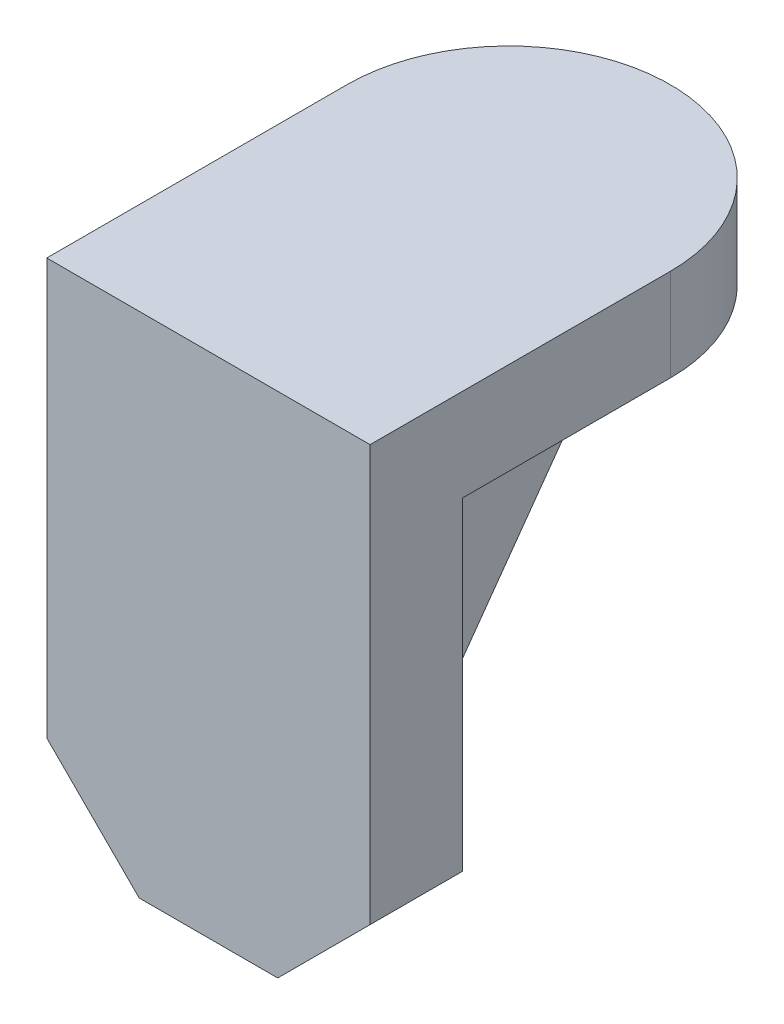
ISO-10303-21;
HEADER;
FILE_DESCRIPTION(('STEP AP214'),'2;1');
FILE_NAME('part.step','',(''),(''),'','','');
FILE_SCHEMA(('AUTOMOTIVE_DESIGN { 1 0 10303 214 1 1 1 1 }'));
ENDSEC;
DATA;
#1=APPLICATION_CONTEXT('core data for automotive mechanical design processes');
#2=APPLICATION_PROTOCOL_DEFINITION('international standard','automotive_design',2000,#1);
#3=PRODUCT_CONTEXT('',#1,'mechanical');
#4=PRODUCT('Part','Part','',(#3));
#5=PRODUCT_RELATED_PRODUCT_CATEGORY('part','',(#4));
#6=PRODUCT_DEFINITION_FORMATION('','',#4);
#7=PRODUCT_DEFINITION_CONTEXT('part definition',#1,'design');
#8=PRODUCT_DEFINITION('design','',#6,#7);
#9=PRODUCT_DEFINITION_SHAPE('','',#8);
#10=(LENGTH_UNIT() NAMED_UNIT(*) SI_UNIT(.MILLI.,.METRE.));
#11=(NAMED_UNIT(*) PLANE_ANGLE_UNIT() SI_UNIT($,.RADIAN.));
#12=(NAMED_UNIT(*) SI_UNIT($,.STERADIAN.) SOLID_ANGLE_UNIT());
#13=UNCERTAINTY_MEASURE_WITH_UNIT(LENGTH_MEASURE(1.E-05),#10,'distance_accuracy_value','');
#14=(GEOMETRIC_REPRESENTATION_CONTEXT(3) GLOBAL_UNCERTAINTY_ASSIGNED_CONTEXT((#13)) GLOBAL_UNIT_ASSIGNED_CONTEXT((#10,
#11,#12)) REPRESENTATION_CONTEXT('',''));
#15=CARTESIAN_POINT('',(0.,0.,0.));
#16=DIRECTION('',(0.,0.,1.));
#17=DIRECTION('',(1.,0.,0.));
#18=AXIS2_PLACEMENT_3D('',#15,#16,#17);
#19=CARTESIAN_POINT('',(0.,0.,0.));
#20=DIRECTION('',(0.,0.,1.));
#21=DIRECTION('',(1.,0.,0.));
#22=AXIS2_PLACEMENT_3D('',#19,#20,#21);
#23=PLANE('',#22);
#24=DIRECTION('',(0.,1.,0.));
#25=VECTOR('',#24,1.);
#26=CARTESIAN_POINT('',(-16.5418995171564,0.,0.));
#27=LINE('',#26,#25);
#28=CARTESIAN_POINT('',(-16.5418995171564,-11.0394060297859,0.));
#29=VERTEX_POINT('',#28);
#30=CARTESIAN_POINT('',(-16.5418995171564,42.9605939702141,0.));
#31=VERTEX_POINT('',#30);
#32=EDGE_CURVE('E66',#29,#31,#27,.T.);
#33=ORIENTED_EDGE('',*,*,#32,.F.);
#34=DIRECTION('',(1.,0.,0.));
#35=VECTOR('',#34,1.);
#36=CARTESIAN_POINT('',(-19.5418995171564,-11.0394060297859,0.));
#37=LINE('',#36,#35);
#38=CARTESIAN_POINT('',(-19.5418995171564,-11.0394060297859,0.));
#39=VERTEX_POINT('',#38);
#40=EDGE_CURVE('E210',#39,#29,#37,.T.);
#41=ORIENTED_EDGE('',*,*,#40,.F.);
#42=DIRECTION('',(0.707106781186548,-0.707106781186547,0.));
#43=VECTOR('',#42,1.);
#44=CARTESIAN_POINT('',(-31.5418995171564,0.960593970214127,0.));
#45=LINE('',#44,#43);
#46=CARTESIAN_POINT('',(-31.5418995171564,0.960593970214127,0.));
#47=VERTEX_POINT('',#46);
#48=EDGE_CURVE('E207',#47,#39,#45,.T.);
#49=ORIENTED_EDGE('',*,*,#48,.F.);
#50=DIRECTION('',(0.,-1.,0.));
#51=VECTOR('',#50,1.);
#52=CARTESIAN_POINT('',(-31.5418995171564,54.9605939702141,0.));
#53=LINE('',#52,#51);
#54=CARTESIAN_POINT('',(-31.5418995171564,42.9605939702141,0.));
#55=VERTEX_POINT('',#54);
#56=EDGE_CURVE('E181',#55,#47,#53,.T.);
#57=ORIENTED_EDGE('',*,*,#56,.F.);
#58=DIRECTION('',(-1.,0.,0.));
#59=VECTOR('',#58,1.);
#60=CARTESIAN_POINT('',(0.,42.9605939702141,0.));
#61=LINE('',#60,#59);
#62=EDGE_CURVE('E170',#31,#55,#61,.T.);
#63=ORIENTED_EDGE('',*,*,#62,.F.);
#64=EDGE_LOOP('',(#33,#41,#49,#57,#63));
#65=FACE_BOUND('',#64,.T.);
#66=ADVANCED_FACE('F41',(#65),#23,.F.);
#67=CARTESIAN_POINT('',(-4.54189951715641,-11.0394060297859,0.));
#68=VERTEX_POINT('',#67);
#69=CARTESIAN_POINT('',(-1.54189951715641,-11.0394060297859,0.));
#70=VERTEX_POINT('',#69);
#71=EDGE_CURVE('E58',#68,#70,#37,.T.);
#72=ORIENTED_EDGE('',*,*,#71,.F.);
#73=DIRECTION('',(0.,1.,0.));
#74=VECTOR('',#73,1.);
#75=CARTESIAN_POINT('',(-4.54189951715641,0.,0.));
#76=LINE('',#75,#74);
#77=CARTESIAN_POINT('',(-4.54189951715641,42.9605939702141,0.));
#78=VERTEX_POINT('',#77);
#79=EDGE_CURVE('E153',#68,#78,#76,.T.);
#80=ORIENTED_EDGE('',*,*,#79,.T.);
#81=CARTESIAN_POINT('',(10.4581004828436,42.9605939702141,0.));
#82=VERTEX_POINT('',#81);
#83=EDGE_CURVE('E171',#82,#78,#61,.T.);
#84=ORIENTED_EDGE('',*,*,#83,.F.);
#85=DIRECTION('',(0.,1.,0.));
#86=VECTOR('',#85,1.);
#87=CARTESIAN_POINT('',(10.4581004828436,0.960593970214126,0.));
#88=LINE('',#87,#86);
#89=CARTESIAN_POINT('',(10.4581004828436,0.960593970214126,0.));
#90=VERTEX_POINT('',#89);
#91=EDGE_CURVE('E189',#90,#82,#88,.T.);
#92=ORIENTED_EDGE('',*,*,#91,.F.);
#93=DIRECTION('',(0.707106781186547,0.707106781186548,0.));
#94=VECTOR('',#93,1.);
#95=CARTESIAN_POINT('',(-1.54189951715641,-11.0394060297859,0.));
#96=LINE('',#95,#94);
#97=EDGE_CURVE('E213',#70,#90,#96,.T.);
#98=ORIENTED_EDGE('',*,*,#97,.F.);
#99=EDGE_LOOP('',(#72,#80,#84,#92,#98));
#100=FACE_BOUND('',#99,.T.);
#101=ADVANCED_FACE('F259',(#100),#23,.F.);
#102=CARTESIAN_POINT('',(-31.5418995171564,54.9605939702141,12.));
#103=DIRECTION('',(0.,-1.,0.));
#104=DIRECTION('',(0.,0.,-1.));
#105=AXIS2_PLACEMENT_3D('',#102,#103,#104);
#106=PLANE('',#105);
#107=DIRECTION('',(0.,0.,-1.));
#108=VECTOR('',#107,1.);
#109=CARTESIAN_POINT('',(-31.5418995171564,54.9605939702141,12.));
#110=LINE('',#109,#108);
#111=CARTESIAN_POINT('',(-31.5418995171564,54.9605939702141,12.));
#112=VERTEX_POINT('',#111);
#113=CARTESIAN_POINT('',(-31.5418995171564,54.9605939702141,-27.));
#114=VERTEX_POINT('',#113);
#115=EDGE_CURVE('E141',#112,#114,#110,.T.);
#116=ORIENTED_EDGE('',*,*,#115,.F.);
#117=DIRECTION('',(-1.,0.,0.));
#118=VECTOR('',#117,1.);
#119=CARTESIAN_POINT('',(-31.5418995171564,54.9605939702141,12.));
#120=LINE('',#119,#118);
#121=CARTESIAN_POINT('',(10.4581004828436,54.9605939702141,12.));
#122=VERTEX_POINT('',#121);
#123=EDGE_CURVE('E185',#122,#112,#120,.T.);
#124=ORIENTED_EDGE('',*,*,#123,.F.);
#125=DIRECTION('',(0.,0.,-1.));
#126=VECTOR('',#125,1.);
#127=CARTESIAN_POINT('',(10.4581004828436,54.9605939702141,12.));
#128=LINE('',#127,#126);
#129=CARTESIAN_POINT('',(10.4581004828436,54.9605939702141,-27.));
#130=VERTEX_POINT('',#129);
#131=EDGE_CURVE('E204',#122,#130,#128,.T.);
#132=ORIENTED_EDGE('',*,*,#131,.T.);
#133=CARTESIAN_POINT('',(-10.5418995171564,54.9605939702141,-27.));
#134=DIRECTION('',(0.,1.,0.));
#135=DIRECTION('',(0.,0.,1.));
#136=AXIS2_PLACEMENT_3D('',#133,#134,#135);
#137=CIRCLE('',#136,21.);
#138=EDGE_CURVE('E158',#130,#114,#137,.T.);
#139=ORIENTED_EDGE('',*,*,#138,.T.);
#140=EDGE_LOOP('',(#116,#124,#132,#139));
#141=FACE_BOUND('',#140,.T.);
#142=ADVANCED_FACE('F43',(#141),#106,.F.);
#143=CARTESIAN_POINT('',(-31.5418995171564,54.9605939702141,12.));
#144=DIRECTION('',(1.,0.,0.));
#145=DIRECTION('',(0.,0.,-1.));
#146=AXIS2_PLACEMENT_3D('',#143,#144,#145);
#147=PLANE('',#146);
#148=ORIENTED_EDGE('',*,*,#115,.T.);
#149=DIRECTION('',(0.,1.,0.));
#150=VECTOR('',#149,1.);
#151=CARTESIAN_POINT('',(-31.5418995171564,42.9605939702141,-27.));
#152=LINE('',#151,#150);
#153=CARTESIAN_POINT('',(-31.5418995171564,42.9605939702141,-27.));
#154=VERTEX_POINT('',#153);
#155=EDGE_CURVE('E177',#154,#114,#152,.T.);
#156=ORIENTED_EDGE('',*,*,#155,.F.);
#157=DIRECTION('',(0.,0.,-1.));
#158=VECTOR('',#157,1.);
#159=CARTESIAN_POINT('',(-31.5418995171564,42.9605939702141,0.));
#160=LINE('',#159,#158);
#161=EDGE_CURVE('E167',#55,#154,#160,.T.);
#162=ORIENTED_EDGE('',*,*,#161,.F.);
#163=ORIENTED_EDGE('',*,*,#56,.T.);
#164=DIRECTION('',(0.,0.,-1.));
#165=VECTOR('',#164,1.);
#166=CARTESIAN_POINT('',(-31.5418995171564,0.960593970214127,12.));
#167=LINE('',#166,#165);
#168=CARTESIAN_POINT('',(-31.5418995171564,0.960593970214127,12.));
#169=VERTEX_POINT('',#168);
#170=EDGE_CURVE('E233',#169,#47,#167,.T.);
#171=ORIENTED_EDGE('',*,*,#170,.F.);
#172=DIRECTION('',(0.,-1.,0.));
#173=VECTOR('',#172,1.);
#174=CARTESIAN_POINT('',(-31.5418995171564,54.9605939702141,12.));
#175=LINE('',#174,#173);
#176=EDGE_CURVE('E188',#112,#169,#175,.T.);
#177=ORIENTED_EDGE('',*,*,#176,.F.);
#178=EDGE_LOOP('',(#148,#156,#162,#163,#171,#177));
#179=FACE_BOUND('',#178,.T.);
#180=ADVANCED_FACE('F243',(#179),#147,.F.);
#181=CARTESIAN_POINT('',(-31.5418995171564,0.960593970214127,12.));
#182=DIRECTION('',(0.707106781186547,0.707106781186548,0.));
#183=DIRECTION('',(-0.707106781186548,0.707106781186547,0.));
#184=AXIS2_PLACEMENT_3D('',#181,#182,#183);
#185=PLANE('',#184);
#186=ORIENTED_EDGE('',*,*,#48,.T.);
#187=DIRECTION('',(0.,0.,-1.));
#188=VECTOR('',#187,1.);
#189=CARTESIAN_POINT('',(-19.5418995171564,-11.0394060297859,12.));
#190=LINE('',#189,#188);
#191=CARTESIAN_POINT('',(-19.5418995171564,-11.0394060297859,12.));
#192=VERTEX_POINT('',#191);
#193=EDGE_CURVE('E229',#192,#39,#190,.T.);
#194=ORIENTED_EDGE('',*,*,#193,.F.);
#195=DIRECTION('',(0.707106781186548,-0.707106781186547,0.));
#196=VECTOR('',#195,1.);
#197=CARTESIAN_POINT('',(-31.5418995171564,0.960593970214127,12.));
#198=LINE('',#197,#196);
#199=EDGE_CURVE('E192',#169,#192,#198,.T.);
#200=ORIENTED_EDGE('',*,*,#199,.F.);
#201=ORIENTED_EDGE('',*,*,#170,.T.);
#202=EDGE_LOOP('',(#186,#194,#200,#201));
#203=FACE_BOUND('',#202,.T.);
#204=ADVANCED_FACE('F289',(#203),#185,.F.);
#205=CARTESIAN_POINT('',(-19.5418995171564,-11.0394060297859,12.));
#206=DIRECTION('',(0.,1.,0.));
#207=DIRECTION('',(0.,0.,1.));
#208=AXIS2_PLACEMENT_3D('',#205,#206,#207);
#209=PLANE('',#208);
#210=ORIENTED_EDGE('',*,*,#40,.T.);
#211=DIRECTION('',(-1.,0.,0.));
#212=VECTOR('',#211,1.);
#213=CARTESIAN_POINT('',(-19.5418995171564,-11.0394060297859,0.));
#214=LINE('',#213,#212);
#215=EDGE_CURVE('E144',#68,#29,#214,.T.);
#216=ORIENTED_EDGE('',*,*,#215,.F.);
#217=ORIENTED_EDGE('',*,*,#71,.T.);
#218=DIRECTION('',(0.,0.,-1.));
#219=VECTOR('',#218,1.);
#220=CARTESIAN_POINT('',(-1.54189951715641,-11.0394060297859,12.));
#221=LINE('',#220,#219);
#222=CARTESIAN_POINT('',(-1.54189951715641,-11.0394060297859,12.));
#223=VERTEX_POINT('',#222);
#224=EDGE_CURVE('E225',#223,#70,#221,.T.);
#225=ORIENTED_EDGE('',*,*,#224,.F.);
#226=DIRECTION('',(1.,0.,0.));
#227=VECTOR('',#226,1.);
#228=CARTESIAN_POINT('',(-19.5418995171564,-11.0394060297859,12.));
#229=LINE('',#228,#227);
#230=EDGE_CURVE('E195',#192,#223,#229,.T.);
#231=ORIENTED_EDGE('',*,*,#230,.F.);
#232=ORIENTED_EDGE('',*,*,#193,.T.);
#233=EDGE_LOOP('',(#210,#216,#217,#225,#231,#232));
#234=FACE_BOUND('',#233,.T.);
#235=ADVANCED_FACE('F285',(#234),#209,.F.);
#236=CARTESIAN_POINT('',(-1.54189951715641,-11.0394060297859,12.));
#237=DIRECTION('',(-0.707106781186548,0.707106781186547,0.));
#238=DIRECTION('',(-0.707106781186547,-0.707106781186548,0.));
#239=AXIS2_PLACEMENT_3D('',#236,#237,#238);
#240=PLANE('',#239);
#241=ORIENTED_EDGE('',*,*,#97,.T.);
#242=DIRECTION('',(0.,0.,-1.));
#243=VECTOR('',#242,1.);
#244=CARTESIAN_POINT('',(10.4581004828436,0.960593970214126,12.));
#245=LINE('',#244,#243);
#246=CARTESIAN_POINT('',(10.4581004828436,0.960593970214126,12.));
#247=VERTEX_POINT('',#246);
#248=EDGE_CURVE('E221',#247,#90,#245,.T.);
#249=ORIENTED_EDGE('',*,*,#248,.F.);
#250=DIRECTION('',(0.707106781186547,0.707106781186548,0.));
#251=VECTOR('',#250,1.);
#252=CARTESIAN_POINT('',(-1.54189951715641,-11.0394060297859,12.));
#253=LINE('',#252,#251);
#254=EDGE_CURVE('E198',#223,#247,#253,.T.);
#255=ORIENTED_EDGE('',*,*,#254,.F.);
#256=ORIENTED_EDGE('',*,*,#224,.T.);
#257=EDGE_LOOP('',(#241,#249,#255,#256));
#258=FACE_BOUND('',#257,.T.);
#259=ADVANCED_FACE('F282',(#258),#240,.F.);
#260=CARTESIAN_POINT('',(10.4581004828436,0.960593970214126,12.));
#261=DIRECTION('',(-1.,0.,0.));
#262=DIRECTION('',(0.,0.,1.));
#263=AXIS2_PLACEMENT_3D('',#260,#261,#262);
#264=PLANE('',#263);
#265=ORIENTED_EDGE('',*,*,#91,.T.);
#266=DIRECTION('',(0.,0.,-1.));
#267=VECTOR('',#266,1.);
#268=CARTESIAN_POINT('',(10.4581004828436,42.9605939702141,0.));
#269=LINE('',#268,#267);
#270=CARTESIAN_POINT('',(10.4581004828436,42.9605939702141,-27.));
#271=VERTEX_POINT('',#270);
#272=EDGE_CURVE('E159',#82,#271,#269,.T.);
#273=ORIENTED_EDGE('',*,*,#272,.T.);
#274=DIRECTION('',(0.,1.,0.));
#275=VECTOR('',#274,1.);
#276=CARTESIAN_POINT('',(10.4581004828436,42.9605939702141,-27.));
#277=LINE('',#276,#275);
#278=EDGE_CURVE('E174',#271,#130,#277,.T.);
#279=ORIENTED_EDGE('',*,*,#278,.T.);
#280=ORIENTED_EDGE('',*,*,#131,.F.);
#281=DIRECTION('',(0.,1.,0.));
#282=VECTOR('',#281,1.);
#283=CARTESIAN_POINT('',(10.4581004828436,0.960593970214126,12.));
#284=LINE('',#283,#282);
#285=EDGE_CURVE('E201',#247,#122,#284,.T.);
#286=ORIENTED_EDGE('',*,*,#285,.F.);
#287=ORIENTED_EDGE('',*,*,#248,.T.);
#288=EDGE_LOOP('',(#265,#273,#279,#280,#286,#287));
#289=FACE_BOUND('',#288,.T.);
#290=ADVANCED_FACE('F254',(#289),#264,.F.);
#291=CARTESIAN_POINT('',(0.,0.,12.));
#292=DIRECTION('',(0.,0.,1.));
#293=DIRECTION('',(1.,0.,0.));
#294=AXIS2_PLACEMENT_3D('',#291,#292,#293);
#295=PLANE('',#294);
#296=ORIENTED_EDGE('',*,*,#230,.T.);
#297=ORIENTED_EDGE('',*,*,#254,.T.);
#298=ORIENTED_EDGE('',*,*,#285,.T.);
#299=ORIENTED_EDGE('',*,*,#123,.T.);
#300=ORIENTED_EDGE('',*,*,#176,.T.);
#301=ORIENTED_EDGE('',*,*,#199,.T.);
#302=EDGE_LOOP('',(#296,#297,#298,#299,#300,#301));
#303=FACE_BOUND('',#302,.T.);
#304=ADVANCED_FACE('F278',(#303),#295,.T.);
#305=CARTESIAN_POINT('',(-10.5418995171564,42.9605939702141,-27.));
#306=DIRECTION('',(0.,1.,0.));
#307=DIRECTION('',(0.,0.,1.));
#308=AXIS2_PLACEMENT_3D('',#305,#306,#307);
#309=CYLINDRICAL_SURFACE('',#308,21.);
#310=ORIENTED_EDGE('',*,*,#155,.T.);
#311=ORIENTED_EDGE('',*,*,#138,.F.);
#312=ORIENTED_EDGE('',*,*,#278,.F.);
#313=CARTESIAN_POINT('',(-10.5418995171564,42.9605939702141,-27.));
#314=DIRECTION('',(0.,1.,0.));
#315=DIRECTION('',(0.,0.,1.));
#316=AXIS2_PLACEMENT_3D('',#313,#314,#315);
#317=CIRCLE('',#316,21.);
#318=EDGE_CURVE('E163',#271,#154,#317,.T.);
#319=ORIENTED_EDGE('',*,*,#318,.T.);
#320=EDGE_LOOP('',(#310,#311,#312,#319));
#321=FACE_BOUND('',#320,.T.);
#322=ADVANCED_FACE('F250',(#321),#309,.T.);
#323=CARTESIAN_POINT('',(0.,42.9605939702141,0.));
#324=DIRECTION('',(0.,1.,0.));
#325=DIRECTION('',(0.,0.,1.));
#326=AXIS2_PLACEMENT_3D('',#323,#324,#325);
#327=PLANE('',#326);
#328=ORIENTED_EDGE('',*,*,#83,.T.);
#329=DIRECTION('',(0.,0.,-1.));
#330=VECTOR('',#329,1.);
#331=CARTESIAN_POINT('',(-4.54189951715641,42.9605939702141,0.));
#332=LINE('',#331,#330);
#333=CARTESIAN_POINT('',(-4.54189951715641,42.9605939702141,-38.7049375817696));
#334=VERTEX_POINT('',#333);
#335=EDGE_CURVE('E11',#78,#334,#332,.T.);
#336=ORIENTED_EDGE('',*,*,#335,.T.);
#337=DIRECTION('',(-1.,0.,0.));
#338=VECTOR('',#337,1.);
#339=CARTESIAN_POINT('',(0.,42.9605939702141,-38.7049375817696));
#340=LINE('',#339,#338);
#341=CARTESIAN_POINT('',(-16.5418995171564,42.9605939702141,-38.7049375817696));
#342=VERTEX_POINT('',#341);
#343=EDGE_CURVE('E51',#334,#342,#340,.T.);
#344=ORIENTED_EDGE('',*,*,#343,.T.);
#345=DIRECTION('',(0.,0.,-1.));
#346=VECTOR('',#345,1.);
#347=CARTESIAN_POINT('',(-16.5418995171564,42.9605939702141,0.));
#348=LINE('',#347,#346);
#349=EDGE_CURVE('E45',#31,#342,#348,.T.);
#350=ORIENTED_EDGE('',*,*,#349,.F.);
#351=ORIENTED_EDGE('',*,*,#62,.T.);
#352=ORIENTED_EDGE('',*,*,#161,.T.);
#353=ORIENTED_EDGE('',*,*,#318,.F.);
#354=ORIENTED_EDGE('',*,*,#272,.F.);
#355=EDGE_LOOP('',(#328,#336,#344,#350,#351,#352,#353,#354));
#356=FACE_BOUND('',#355,.T.);
#357=ADVANCED_FACE('F128',(#356),#327,.F.);
#358=CARTESIAN_POINT('',(-10.5418995171564,43.0416498924127,-38.7630350708312));
#359=DIRECTION('',(0.,-0.582568040227916,-0.812781937856031));
#360=DIRECTION('',(0.,0.812781937856031,-0.582568040227916));
#361=AXIS2_PLACEMENT_3D('',#358,#359,#360);
#362=PLANE('',#361);
#363=DIRECTION('',(0.,0.812781937856031,-0.582568040227916));
#364=VECTOR('',#363,1.);
#365=CARTESIAN_POINT('',(-4.54189951715641,-11.0394060297859,0.));
#366=LINE('',#365,#364);
#367=EDGE_CURVE('E146',#68,#334,#366,.T.);
#368=ORIENTED_EDGE('',*,*,#367,.F.);
#369=ORIENTED_EDGE('',*,*,#215,.T.);
#370=DIRECTION('',(0.,0.812781937856031,-0.582568040227916));
#371=VECTOR('',#370,1.);
#372=CARTESIAN_POINT('',(-16.5418995171564,-11.0394060297859,0.));
#373=LINE('',#372,#371);
#374=EDGE_CURVE('E139',#29,#342,#373,.T.);
#375=ORIENTED_EDGE('',*,*,#374,.T.);
#376=ORIENTED_EDGE('',*,*,#343,.F.);
#377=EDGE_LOOP('',(#368,#369,#375,#376));
#378=FACE_BOUND('',#377,.T.);
#379=ADVANCED_FACE('F143',(#378),#362,.T.);
#380=CARTESIAN_POINT('',(-4.54189951715641,-11.0394060297859,0.));
#381=DIRECTION('',(1.,0.,0.));
#382=DIRECTION('',(0.,0.,-1.));
#383=AXIS2_PLACEMENT_3D('',#380,#381,#382);
#384=PLANE('',#383);
#385=ORIENTED_EDGE('',*,*,#79,.F.);
#386=ORIENTED_EDGE('',*,*,#367,.T.);
#387=ORIENTED_EDGE('',*,*,#335,.F.);
#388=EDGE_LOOP('',(#385,#386,#387));
#389=FACE_BOUND('',#388,.T.);
#390=ADVANCED_FACE('F262',(#389),#384,.T.);
#391=CARTESIAN_POINT('',(-16.5418995171564,-11.0394060297859,0.));
#392=DIRECTION('',(1.,0.,0.));
#393=DIRECTION('',(0.,0.,-1.));
#394=AXIS2_PLACEMENT_3D('',#391,#392,#393);
#395=PLANE('',#394);
#396=ORIENTED_EDGE('',*,*,#374,.F.);
#397=ORIENTED_EDGE('',*,*,#32,.T.);
#398=ORIENTED_EDGE('',*,*,#349,.T.);
#399=EDGE_LOOP('',(#396,#397,#398));
#400=FACE_BOUND('',#399,.T.);
#401=ADVANCED_FACE('F138',(#400),#395,.F.);
#402=CLOSED_SHELL('',(#66,#101,#142,#180,#204,#235,#259,#290,#304,#322,#357,#379,#390,#401));
#403=MANIFOLD_SOLID_BREP('B2',#402);
#404=ADVANCED_BREP_SHAPE_REPRESENTATION('',(#18,#403),#14);
#405=SHAPE_DEFINITION_REPRESENTATION(#9,#404);
ENDSEC;
END-ISO-10303-21;
